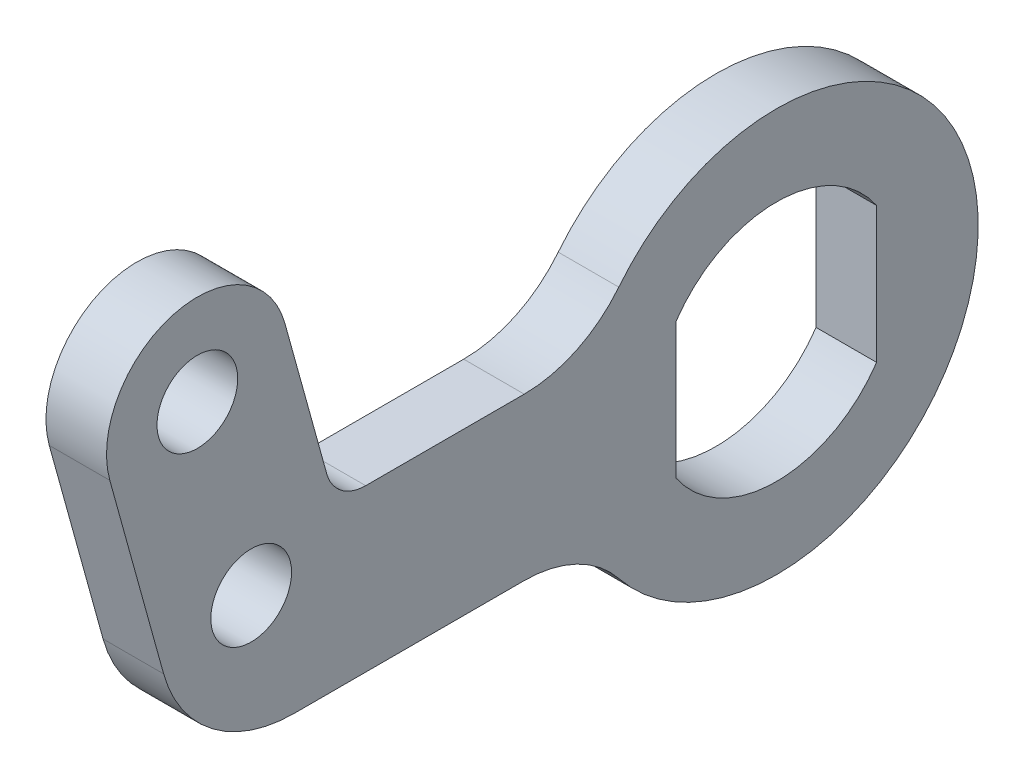
ISO-10303-21;
HEADER;
FILE_DESCRIPTION(('STEP AP214'),'2;1');
FILE_NAME('part.step','',(''),(''),'','','');
FILE_SCHEMA(('AUTOMOTIVE_DESIGN { 1 0 10303 214 1 1 1 1 }'));
ENDSEC;
DATA;
#1=APPLICATION_CONTEXT('core data for automotive mechanical design processes');
#2=APPLICATION_PROTOCOL_DEFINITION('international standard','automotive_design',2000,#1);
#3=PRODUCT_CONTEXT('',#1,'mechanical');
#4=PRODUCT('Part','Part','',(#3));
#5=PRODUCT_RELATED_PRODUCT_CATEGORY('part','',(#4));
#6=PRODUCT_DEFINITION_FORMATION('','',#4);
#7=PRODUCT_DEFINITION_CONTEXT('part definition',#1,'design');
#8=PRODUCT_DEFINITION('design','',#6,#7);
#9=PRODUCT_DEFINITION_SHAPE('','',#8);
#10=(LENGTH_UNIT() NAMED_UNIT(*) SI_UNIT(.MILLI.,.METRE.));
#11=(NAMED_UNIT(*) PLANE_ANGLE_UNIT() SI_UNIT($,.RADIAN.));
#12=(NAMED_UNIT(*) SI_UNIT($,.STERADIAN.) SOLID_ANGLE_UNIT());
#13=UNCERTAINTY_MEASURE_WITH_UNIT(LENGTH_MEASURE(1.E-05),#10,'distance_accuracy_value','');
#14=(GEOMETRIC_REPRESENTATION_CONTEXT(3) GLOBAL_UNCERTAINTY_ASSIGNED_CONTEXT((#13)) GLOBAL_UNIT_ASSIGNED_CONTEXT((#10,
#11,#12)) REPRESENTATION_CONTEXT('',''));
#15=CARTESIAN_POINT('',(0.,0.,0.));
#16=DIRECTION('',(0.,0.,1.));
#17=DIRECTION('',(1.,0.,0.));
#18=AXIS2_PLACEMENT_3D('',#15,#16,#17);
#19=CARTESIAN_POINT('',(1.5,4.99999949839973,-6.7641026));
#20=DIRECTION('',(-1.,0.,0.));
#21=DIRECTION('',(0.,0.,1.));
#22=AXIS2_PLACEMENT_3D('',#19,#20,#21);
#23=PLANE('',#22);
#24=CARTESIAN_POINT('',(1.5,4.99999949839973,-6.7641026));
#25=DIRECTION('',(-1.,0.,0.));
#26=DIRECTION('',(0.,0.,1.));
#27=AXIS2_PLACEMENT_3D('',#24,#25,#26);
#28=CIRCLE('',#27,3.);
#29=CARTESIAN_POINT('',(1.5,3.12499968649983,-9.105977));
#30=VERTEX_POINT('',#29);
#31=CARTESIAN_POINT('',(1.5,1.99999949839973,-6.7641026));
#32=VERTEX_POINT('',#31);
#33=EDGE_CURVE('E174',#30,#32,#28,.T.);
#34=ORIENTED_EDGE('',*,*,#33,.T.);
#35=DIRECTION('',(0.,0.,1.));
#36=VECTOR('',#35,1.);
#37=CARTESIAN_POINT('',(1.5,1.99999949839973,-6.7641026));
#38=LINE('',#37,#36);
#39=CARTESIAN_POINT('',(1.5,1.99999949839973,-2.83655563));
#40=VERTEX_POINT('',#39);
#41=EDGE_CURVE('E177',#32,#40,#38,.T.);
#42=ORIENTED_EDGE('',*,*,#41,.T.);
#43=CARTESIAN_POINT('',(1.5,2.99999949839973,-2.83655563));
#44=DIRECTION('',(-1.,0.,0.));
#45=DIRECTION('',(0.,0.,1.));
#46=AXIS2_PLACEMENT_3D('',#43,#44,#45);
#47=CIRCLE('',#46,1.);
#48=CARTESIAN_POINT('',(1.5,2.7333219044414,-1.87276983383957));
#49=VERTEX_POINT('',#48);
#50=EDGE_CURVE('E180',#40,#49,#47,.T.);
#51=ORIENTED_EDGE('',*,*,#50,.T.);
#52=DIRECTION('',(0.,0.963785796160433,0.266677593958325));
#53=VECTOR('',#52,1.);
#54=CARTESIAN_POINT('',(1.5,2.7333219044414,-1.87276983383957));
#55=LINE('',#54,#53);
#56=CARTESIAN_POINT('',(1.5,6.48340441860382,-0.835129534505308));
#57=VERTEX_POINT('',#56);
#58=EDGE_CURVE('E182',#49,#57,#55,.T.);
#59=ORIENTED_EDGE('',*,*,#58,.T.);
#60=CARTESIAN_POINT('',(1.5,5.88337983219759,1.33338850685566));
#61=DIRECTION('',(1.,0.,0.));
#62=DIRECTION('',(0.,0.,1.));
#63=AXIS2_PLACEMENT_3D('',#60,#61,#62);
#64=CIRCLE('',#63,2.25);
#65=CARTESIAN_POINT('',(1.5,5.28335512053363,3.50190651355807));
#66=VERTEX_POINT('',#65);
#67=EDGE_CURVE('E184',#57,#66,#64,.T.);
#68=ORIENTED_EDGE('',*,*,#67,.T.);
#69=DIRECTION('',(0.,-0.963785780756626,-0.266677649628424));
#70=VECTOR('',#69,1.);
#71=CARTESIAN_POINT('',(1.5,0.464427051240978,2.16851849631784));
#72=LINE('',#71,#70);
#73=CARTESIAN_POINT('',(1.5,0.464427051240978,2.16851849631784));
#74=VERTEX_POINT('',#73);
#75=EDGE_CURVE('E186',#66,#74,#72,.T.);
#76=ORIENTED_EDGE('',*,*,#75,.T.);
#77=CARTESIAN_POINT('',(1.5,1.36063249160027,-1.07041083));
#78=DIRECTION('',(1.,0.,0.));
#79=DIRECTION('',(0.,0.,1.));
#80=AXIS2_PLACEMENT_3D('',#77,#78,#79);
#81=CIRCLE('',#80,3.36063199);
#82=CARTESIAN_POINT('',(1.5,-1.99999949839973,-1.07041083));
#83=VERTEX_POINT('',#82);
#84=EDGE_CURVE('E188',#74,#83,#81,.T.);
#85=ORIENTED_EDGE('',*,*,#84,.T.);
#86=DIRECTION('',(0.,0.,-1.));
#87=VECTOR('',#86,1.);
#88=CARTESIAN_POINT('',(1.5,-1.99999949839973,-6.7641026));
#89=LINE('',#88,#87);
#90=CARTESIAN_POINT('',(1.5,-1.99999949839973,-6.7641026));
#91=VERTEX_POINT('',#90);
#92=EDGE_CURVE('E190',#83,#91,#89,.T.);
#93=ORIENTED_EDGE('',*,*,#92,.T.);
#94=CARTESIAN_POINT('',(1.5,-4.99999949839973,-6.7641026));
#95=DIRECTION('',(-1.,0.,0.));
#96=DIRECTION('',(0.,0.,-1.));
#97=AXIS2_PLACEMENT_3D('',#94,#95,#96);
#98=CIRCLE('',#97,3.);
#99=CARTESIAN_POINT('',(1.5,-3.12499968649983,-9.105977));
#100=VERTEX_POINT('',#99);
#101=EDGE_CURVE('E192',#91,#100,#98,.T.);
#102=ORIENTED_EDGE('',*,*,#101,.T.);
#103=CARTESIAN_POINT('',(1.5,0.,-13.009101));
#104=DIRECTION('',(1.,0.,0.));
#105=DIRECTION('',(0.,0.,1.));
#106=AXIS2_PLACEMENT_3D('',#103,#104,#105);
#107=CIRCLE('',#106,5.);
#108=EDGE_CURVE('E194',#100,#30,#107,.T.);
#109=ORIENTED_EDGE('',*,*,#108,.T.);
#110=EDGE_LOOP('',(#34,#42,#51,#59,#68,#76,#85,#93,#102,#109));
#111=FACE_BOUND('',#110,.T.);
#112=CARTESIAN_POINT('',(1.5,0.,-13.009101));
#113=DIRECTION('',(1.,0.,0.));
#114=DIRECTION('',(0.,0.,1.));
#115=AXIS2_PLACEMENT_3D('',#112,#113,#114);
#116=CIRCLE('',#115,3.00000000000001);
#117=CARTESIAN_POINT('',(1.5,1.68316880053992,-15.492434));
#118=VERTEX_POINT('',#117);
#119=CARTESIAN_POINT('',(1.5,1.68316880053992,-10.525768));
#120=VERTEX_POINT('',#119);
#121=EDGE_CURVE('E135',#118,#120,#116,.T.);
#122=ORIENTED_EDGE('',*,*,#121,.F.);
#123=DIRECTION('',(0.,1.,0.));
#124=VECTOR('',#123,1.);
#125=CARTESIAN_POINT('',(1.5,1.68316880053992,-15.492434));
#126=LINE('',#125,#124);
#127=CARTESIAN_POINT('',(1.5,-1.68316880053992,-15.492434));
#128=VERTEX_POINT('',#127);
#129=EDGE_CURVE('E158',#128,#118,#126,.T.);
#130=ORIENTED_EDGE('',*,*,#129,.F.);
#131=CARTESIAN_POINT('',(1.5,0.,-13.009101));
#132=DIRECTION('',(1.,0.,0.));
#133=DIRECTION('',(0.,0.,-1.));
#134=AXIS2_PLACEMENT_3D('',#131,#132,#133);
#135=CIRCLE('',#134,3.00000000000005);
#136=CARTESIAN_POINT('',(1.5,-1.68316880053992,-10.525768));
#137=VERTEX_POINT('',#136);
#138=EDGE_CURVE('E156',#137,#128,#135,.T.);
#139=ORIENTED_EDGE('',*,*,#138,.F.);
#140=DIRECTION('',(0.,-1.,0.));
#141=VECTOR('',#140,1.);
#142=CARTESIAN_POINT('',(1.5,1.68316880053992,-10.525768));
#143=LINE('',#142,#141);
#144=EDGE_CURVE('E143',#120,#137,#143,.T.);
#145=ORIENTED_EDGE('',*,*,#144,.F.);
#146=EDGE_LOOP('',(#122,#130,#139,#145));
#147=FACE_BOUND('',#146,.T.);
#148=CARTESIAN_POINT('',(1.5,1.064451,0.));
#149=DIRECTION('',(1.,0.,0.));
#150=DIRECTION('',(0.,0.,-1.));
#151=AXIS2_PLACEMENT_3D('',#148,#149,#150);
#152=CIRCLE('',#151,1.);
#153=CARTESIAN_POINT('',(1.5,1.064451,-1.));
#154=VERTEX_POINT('',#153);
#155=EDGE_CURVE('E164',#154,#154,#152,.T.);
#156=ORIENTED_EDGE('',*,*,#155,.F.);
#157=EDGE_LOOP('',(#156));
#158=FACE_BOUND('',#157,.T.);
#159=CARTESIAN_POINT('',(1.5,5.88337983219759,1.33338850685566));
#160=DIRECTION('',(1.,0.,0.));
#161=DIRECTION('',(0.,0.,-1.));
#162=AXIS2_PLACEMENT_3D('',#159,#160,#161);
#163=CIRCLE('',#162,0.999999999999999);
#164=CARTESIAN_POINT('',(1.5,5.88337983219759,0.333388506855665));
#165=VERTEX_POINT('',#164);
#166=EDGE_CURVE('E443',#165,#165,#163,.T.);
#167=ORIENTED_EDGE('',*,*,#166,.F.);
#168=EDGE_LOOP('',(#167));
#169=FACE_BOUND('',#168,.T.);
#170=ADVANCED_FACE('F34',(#111,#147,#158,#169),#23,.F.);
#171=CARTESIAN_POINT('',(0.,4.99999949839973,-6.7641026));
#172=DIRECTION('',(-1.,0.,0.));
#173=DIRECTION('',(0.,0.,1.));
#174=AXIS2_PLACEMENT_3D('',#171,#172,#173);
#175=PLANE('',#174);
#176=CARTESIAN_POINT('',(0.,1.064451,0.));
#177=DIRECTION('',(1.,0.,0.));
#178=DIRECTION('',(0.,0.,-1.));
#179=AXIS2_PLACEMENT_3D('',#176,#177,#178);
#180=CIRCLE('',#179,1.);
#181=CARTESIAN_POINT('',(0.,1.064451,-1.));
#182=VERTEX_POINT('',#181);
#183=EDGE_CURVE('E449',#182,#182,#180,.T.);
#184=ORIENTED_EDGE('',*,*,#183,.T.);
#185=EDGE_LOOP('',(#184));
#186=FACE_BOUND('',#185,.T.);
#187=CARTESIAN_POINT('',(0.,4.99999949839973,-6.7641026));
#188=DIRECTION('',(-1.,0.,0.));
#189=DIRECTION('',(0.,0.,1.));
#190=AXIS2_PLACEMENT_3D('',#187,#188,#189);
#191=CIRCLE('',#190,3.);
#192=CARTESIAN_POINT('',(0.,3.12499968649983,-9.105977));
#193=VERTEX_POINT('',#192);
#194=CARTESIAN_POINT('',(0.,1.99999949839973,-6.7641026));
#195=VERTEX_POINT('',#194);
#196=EDGE_CURVE('E151',#193,#195,#191,.T.);
#197=ORIENTED_EDGE('',*,*,#196,.F.);
#198=CARTESIAN_POINT('',(0.,0.,-13.009101));
#199=DIRECTION('',(1.,0.,0.));
#200=DIRECTION('',(0.,0.,1.));
#201=AXIS2_PLACEMENT_3D('',#198,#199,#200);
#202=CIRCLE('',#201,5.);
#203=CARTESIAN_POINT('',(0.,-3.12499968649983,-9.105977));
#204=VERTEX_POINT('',#203);
#205=EDGE_CURVE('E178',#204,#193,#202,.T.);
#206=ORIENTED_EDGE('',*,*,#205,.F.);
#207=CARTESIAN_POINT('',(0.,-4.99999949839973,-6.7641026));
#208=DIRECTION('',(-1.,0.,0.));
#209=DIRECTION('',(0.,0.,-1.));
#210=AXIS2_PLACEMENT_3D('',#207,#208,#209);
#211=CIRCLE('',#210,3.);
#212=CARTESIAN_POINT('',(0.,-1.99999949839973,-6.7641026));
#213=VERTEX_POINT('',#212);
#214=EDGE_CURVE('E213',#213,#204,#211,.T.);
#215=ORIENTED_EDGE('',*,*,#214,.F.);
#216=DIRECTION('',(0.,0.,-1.));
#217=VECTOR('',#216,1.);
#218=CARTESIAN_POINT('',(0.,-1.99999949839973,-6.7641026));
#219=LINE('',#218,#217);
#220=CARTESIAN_POINT('',(0.,-1.99999949839973,-1.07041083));
#221=VERTEX_POINT('',#220);
#222=EDGE_CURVE('E211',#221,#213,#219,.T.);
#223=ORIENTED_EDGE('',*,*,#222,.F.);
#224=CARTESIAN_POINT('',(0.,1.36063249160027,-1.07041083));
#225=DIRECTION('',(1.,0.,0.));
#226=DIRECTION('',(0.,0.,1.));
#227=AXIS2_PLACEMENT_3D('',#224,#225,#226);
#228=CIRCLE('',#227,3.36063199);
#229=CARTESIAN_POINT('',(0.,0.464427051240978,2.16851849631784));
#230=VERTEX_POINT('',#229);
#231=EDGE_CURVE('E209',#230,#221,#228,.T.);
#232=ORIENTED_EDGE('',*,*,#231,.F.);
#233=DIRECTION('',(0.,-0.963785780756626,-0.266677649628424));
#234=VECTOR('',#233,1.);
#235=CARTESIAN_POINT('',(0.,0.464427051240978,2.16851849631784));
#236=LINE('',#235,#234);
#237=CARTESIAN_POINT('',(0.,5.28335512053363,3.50190651355807));
#238=VERTEX_POINT('',#237);
#239=EDGE_CURVE('E207',#238,#230,#236,.T.);
#240=ORIENTED_EDGE('',*,*,#239,.F.);
#241=CARTESIAN_POINT('',(0.,5.88337983219759,1.33338850685566));
#242=DIRECTION('',(1.,0.,0.));
#243=DIRECTION('',(0.,0.,1.));
#244=AXIS2_PLACEMENT_3D('',#241,#242,#243);
#245=CIRCLE('',#244,2.25);
#246=CARTESIAN_POINT('',(0.,6.48340441860382,-0.835129534505308));
#247=VERTEX_POINT('',#246);
#248=EDGE_CURVE('E205',#247,#238,#245,.T.);
#249=ORIENTED_EDGE('',*,*,#248,.F.);
#250=DIRECTION('',(0.,0.963785796160433,0.266677593958325));
#251=VECTOR('',#250,1.);
#252=CARTESIAN_POINT('',(0.,2.7333219044414,-1.87276983383957));
#253=LINE('',#252,#251);
#254=CARTESIAN_POINT('',(0.,2.7333219044414,-1.87276983383957));
#255=VERTEX_POINT('',#254);
#256=EDGE_CURVE('E203',#255,#247,#253,.T.);
#257=ORIENTED_EDGE('',*,*,#256,.F.);
#258=CARTESIAN_POINT('',(0.,2.99999949839973,-2.83655563));
#259=DIRECTION('',(-1.,0.,0.));
#260=DIRECTION('',(0.,0.,1.));
#261=AXIS2_PLACEMENT_3D('',#258,#259,#260);
#262=CIRCLE('',#261,1.);
#263=CARTESIAN_POINT('',(0.,1.99999949839973,-2.83655563));
#264=VERTEX_POINT('',#263);
#265=EDGE_CURVE('E201',#264,#255,#262,.T.);
#266=ORIENTED_EDGE('',*,*,#265,.F.);
#267=DIRECTION('',(0.,0.,1.));
#268=VECTOR('',#267,1.);
#269=CARTESIAN_POINT('',(0.,1.99999949839973,-6.7641026));
#270=LINE('',#269,#268);
#271=EDGE_CURVE('E199',#195,#264,#270,.T.);
#272=ORIENTED_EDGE('',*,*,#271,.F.);
#273=EDGE_LOOP('',(#197,#206,#215,#223,#232,#240,#249,#257,#266,#272));
#274=FACE_BOUND('',#273,.T.);
#275=DIRECTION('',(0.,1.,0.));
#276=VECTOR('',#275,1.);
#277=CARTESIAN_POINT('',(0.,1.68316880053992,-15.492434));
#278=LINE('',#277,#276);
#279=CARTESIAN_POINT('',(0.,-1.68316880053992,-15.492434));
#280=VERTEX_POINT('',#279);
#281=CARTESIAN_POINT('',(0.,1.68316880053992,-15.492434));
#282=VERTEX_POINT('',#281);
#283=EDGE_CURVE('E144',#280,#282,#278,.T.);
#284=ORIENTED_EDGE('',*,*,#283,.T.);
#285=CARTESIAN_POINT('',(0.,0.,-13.009101));
#286=DIRECTION('',(1.,0.,0.));
#287=DIRECTION('',(0.,0.,1.));
#288=AXIS2_PLACEMENT_3D('',#285,#286,#287);
#289=CIRCLE('',#288,3.00000000000001);
#290=CARTESIAN_POINT('',(0.,1.68316880053992,-10.525768));
#291=VERTEX_POINT('',#290);
#292=EDGE_CURVE('E57',#282,#291,#289,.T.);
#293=ORIENTED_EDGE('',*,*,#292,.T.);
#294=DIRECTION('',(0.,-1.,0.));
#295=VECTOR('',#294,1.);
#296=CARTESIAN_POINT('',(0.,1.68316880053992,-10.525768));
#297=LINE('',#296,#295);
#298=CARTESIAN_POINT('',(0.,-1.68316880053992,-10.525768));
#299=VERTEX_POINT('',#298);
#300=EDGE_CURVE('E150',#291,#299,#297,.T.);
#301=ORIENTED_EDGE('',*,*,#300,.T.);
#302=CARTESIAN_POINT('',(0.,0.,-13.009101));
#303=DIRECTION('',(1.,0.,0.));
#304=DIRECTION('',(0.,0.,-1.));
#305=AXIS2_PLACEMENT_3D('',#302,#303,#304);
#306=CIRCLE('',#305,3.00000000000005);
#307=EDGE_CURVE('E166',#299,#280,#306,.T.);
#308=ORIENTED_EDGE('',*,*,#307,.T.);
#309=EDGE_LOOP('',(#284,#293,#301,#308));
#310=FACE_BOUND('',#309,.T.);
#311=CARTESIAN_POINT('',(0.,5.88337983219759,1.33338850685566));
#312=DIRECTION('',(1.,0.,0.));
#313=DIRECTION('',(0.,0.,-1.));
#314=AXIS2_PLACEMENT_3D('',#311,#312,#313);
#315=CIRCLE('',#314,0.999999999999999);
#316=CARTESIAN_POINT('',(0.,5.88337983219759,0.333388506855665));
#317=VERTEX_POINT('',#316);
#318=EDGE_CURVE('E446',#317,#317,#315,.T.);
#319=ORIENTED_EDGE('',*,*,#318,.T.);
#320=EDGE_LOOP('',(#319));
#321=FACE_BOUND('',#320,.T.);
#322=ADVANCED_FACE('F249',(#186,#274,#310,#321),#175,.T.);
#323=CARTESIAN_POINT('',(1.5,4.99999949839973,-6.7641026));
#324=DIRECTION('',(-1.,0.,0.));
#325=DIRECTION('',(0.,0.,1.));
#326=AXIS2_PLACEMENT_3D('',#323,#324,#325);
#327=CYLINDRICAL_SURFACE('',#326,3.);
#328=ORIENTED_EDGE('',*,*,#196,.T.);
#329=DIRECTION('',(-1.,0.,0.));
#330=VECTOR('',#329,1.);
#331=CARTESIAN_POINT('',(1.5,1.99999949839973,-6.7641026));
#332=LINE('',#331,#330);
#333=EDGE_CURVE('E11',#32,#195,#332,.T.);
#334=ORIENTED_EDGE('',*,*,#333,.F.);
#335=ORIENTED_EDGE('',*,*,#33,.F.);
#336=DIRECTION('',(-1.,0.,0.));
#337=VECTOR('',#336,1.);
#338=CARTESIAN_POINT('',(1.5,3.12499968649983,-9.105977));
#339=LINE('',#338,#337);
#340=EDGE_CURVE('E196',#30,#193,#339,.T.);
#341=ORIENTED_EDGE('',*,*,#340,.T.);
#342=EDGE_LOOP('',(#328,#334,#335,#341));
#343=FACE_BOUND('',#342,.T.);
#344=ADVANCED_FACE('F36',(#343),#327,.F.);
#345=CARTESIAN_POINT('',(1.5,1.99999949839973,-6.7641026));
#346=DIRECTION('',(0.,-1.,0.));
#347=DIRECTION('',(0.,0.,-1.));
#348=AXIS2_PLACEMENT_3D('',#345,#346,#347);
#349=PLANE('',#348);
#350=ORIENTED_EDGE('',*,*,#271,.T.);
#351=DIRECTION('',(-1.,0.,0.));
#352=VECTOR('',#351,1.);
#353=CARTESIAN_POINT('',(1.5,1.99999949839973,-2.83655563));
#354=LINE('',#353,#352);
#355=EDGE_CURVE('E42',#40,#264,#354,.T.);
#356=ORIENTED_EDGE('',*,*,#355,.F.);
#357=ORIENTED_EDGE('',*,*,#41,.F.);
#358=ORIENTED_EDGE('',*,*,#333,.T.);
#359=EDGE_LOOP('',(#350,#356,#357,#358));
#360=FACE_BOUND('',#359,.T.);
#361=ADVANCED_FACE('F266',(#360),#349,.F.);
#362=CARTESIAN_POINT('',(1.5,2.99999949839973,-2.83655563));
#363=DIRECTION('',(-1.,0.,0.));
#364=DIRECTION('',(0.,0.,1.));
#365=AXIS2_PLACEMENT_3D('',#362,#363,#364);
#366=CYLINDRICAL_SURFACE('',#365,1.);
#367=ORIENTED_EDGE('',*,*,#265,.T.);
#368=DIRECTION('',(-1.,0.,0.));
#369=VECTOR('',#368,1.);
#370=CARTESIAN_POINT('',(1.5,2.7333219044414,-1.87276983383957));
#371=LINE('',#370,#369);
#372=EDGE_CURVE('E236',#49,#255,#371,.T.);
#373=ORIENTED_EDGE('',*,*,#372,.F.);
#374=ORIENTED_EDGE('',*,*,#50,.F.);
#375=ORIENTED_EDGE('',*,*,#355,.T.);
#376=EDGE_LOOP('',(#367,#373,#374,#375));
#377=FACE_BOUND('',#376,.T.);
#378=ADVANCED_FACE('F243',(#377),#366,.F.);
#379=CARTESIAN_POINT('',(1.5,2.7333219044414,-1.87276983383957));
#380=DIRECTION('',(0.,-0.266677593958325,0.963785796160432));
#381=DIRECTION('',(0.,-0.963785796160433,-0.266677593958325));
#382=AXIS2_PLACEMENT_3D('',#379,#380,#381);
#383=PLANE('',#382);
#384=ORIENTED_EDGE('',*,*,#256,.T.);
#385=DIRECTION('',(-1.,0.,0.));
#386=VECTOR('',#385,1.);
#387=CARTESIAN_POINT('',(1.5,6.48340441860382,-0.835129534505308));
#388=LINE('',#387,#386);
#389=EDGE_CURVE('E233',#57,#247,#388,.T.);
#390=ORIENTED_EDGE('',*,*,#389,.F.);
#391=ORIENTED_EDGE('',*,*,#58,.F.);
#392=ORIENTED_EDGE('',*,*,#372,.T.);
#393=EDGE_LOOP('',(#384,#390,#391,#392));
#394=FACE_BOUND('',#393,.T.);
#395=ADVANCED_FACE('F255',(#394),#383,.F.);
#396=CARTESIAN_POINT('',(1.5,5.88337983219759,1.33338850685566));
#397=DIRECTION('',(-1.,0.,0.));
#398=DIRECTION('',(0.,0.,1.));
#399=AXIS2_PLACEMENT_3D('',#396,#397,#398);
#400=CYLINDRICAL_SURFACE('',#399,2.25);
#401=ORIENTED_EDGE('',*,*,#248,.T.);
#402=DIRECTION('',(-1.,0.,0.));
#403=VECTOR('',#402,1.);
#404=CARTESIAN_POINT('',(1.5,5.28335512053363,3.50190651355807));
#405=LINE('',#404,#403);
#406=EDGE_CURVE('E230',#66,#238,#405,.T.);
#407=ORIENTED_EDGE('',*,*,#406,.F.);
#408=ORIENTED_EDGE('',*,*,#67,.F.);
#409=ORIENTED_EDGE('',*,*,#389,.T.);
#410=EDGE_LOOP('',(#401,#407,#408,#409));
#411=FACE_BOUND('',#410,.T.);
#412=ADVANCED_FACE('F259',(#411),#400,.T.);
#413=CARTESIAN_POINT('',(1.5,0.464427051240978,2.16851849631784));
#414=DIRECTION('',(0.,0.266677649628424,-0.963785780756626));
#415=DIRECTION('',(0.,0.963785780756626,0.266677649628424));
#416=AXIS2_PLACEMENT_3D('',#413,#414,#415);
#417=PLANE('',#416);
#418=ORIENTED_EDGE('',*,*,#239,.T.);
#419=DIRECTION('',(-1.,0.,0.));
#420=VECTOR('',#419,1.);
#421=CARTESIAN_POINT('',(1.5,0.464427051240978,2.16851849631784));
#422=LINE('',#421,#420);
#423=EDGE_CURVE('E227',#74,#230,#422,.T.);
#424=ORIENTED_EDGE('',*,*,#423,.F.);
#425=ORIENTED_EDGE('',*,*,#75,.F.);
#426=ORIENTED_EDGE('',*,*,#406,.T.);
#427=EDGE_LOOP('',(#418,#424,#425,#426));
#428=FACE_BOUND('',#427,.T.);
#429=ADVANCED_FACE('F289',(#428),#417,.F.);
#430=CARTESIAN_POINT('',(1.5,1.36063249160027,-1.07041083));
#431=DIRECTION('',(-1.,0.,0.));
#432=DIRECTION('',(0.,0.,1.));
#433=AXIS2_PLACEMENT_3D('',#430,#431,#432);
#434=CYLINDRICAL_SURFACE('',#433,3.36063199);
#435=ORIENTED_EDGE('',*,*,#231,.T.);
#436=DIRECTION('',(-1.,0.,0.));
#437=VECTOR('',#436,1.);
#438=CARTESIAN_POINT('',(1.5,-1.99999949839973,-1.07041083));
#439=LINE('',#438,#437);
#440=EDGE_CURVE('E224',#83,#221,#439,.T.);
#441=ORIENTED_EDGE('',*,*,#440,.F.);
#442=ORIENTED_EDGE('',*,*,#84,.F.);
#443=ORIENTED_EDGE('',*,*,#423,.T.);
#444=EDGE_LOOP('',(#435,#441,#442,#443));
#445=FACE_BOUND('',#444,.T.);
#446=ADVANCED_FACE('F286',(#445),#434,.T.);
#447=CARTESIAN_POINT('',(1.5,-1.99999949839973,-6.7641026));
#448=DIRECTION('',(0.,1.,0.));
#449=DIRECTION('',(0.,0.,1.));
#450=AXIS2_PLACEMENT_3D('',#447,#448,#449);
#451=PLANE('',#450);
#452=ORIENTED_EDGE('',*,*,#222,.T.);
#453=DIRECTION('',(-1.,0.,0.));
#454=VECTOR('',#453,1.);
#455=CARTESIAN_POINT('',(1.5,-1.99999949839973,-6.7641026));
#456=LINE('',#455,#454);
#457=EDGE_CURVE('E221',#91,#213,#456,.T.);
#458=ORIENTED_EDGE('',*,*,#457,.F.);
#459=ORIENTED_EDGE('',*,*,#92,.F.);
#460=ORIENTED_EDGE('',*,*,#440,.T.);
#461=EDGE_LOOP('',(#452,#458,#459,#460));
#462=FACE_BOUND('',#461,.T.);
#463=ADVANCED_FACE('F282',(#462),#451,.F.);
#464=CARTESIAN_POINT('',(1.5,-4.99999949839973,-6.7641026));
#465=DIRECTION('',(-1.,0.,0.));
#466=DIRECTION('',(0.,0.,1.));
#467=AXIS2_PLACEMENT_3D('',#464,#465,#466);
#468=CYLINDRICAL_SURFACE('',#467,3.);
#469=ORIENTED_EDGE('',*,*,#214,.T.);
#470=DIRECTION('',(-1.,0.,0.));
#471=VECTOR('',#470,1.);
#472=CARTESIAN_POINT('',(1.5,-3.12499968649983,-9.105977));
#473=LINE('',#472,#471);
#474=EDGE_CURVE('E218',#100,#204,#473,.T.);
#475=ORIENTED_EDGE('',*,*,#474,.F.);
#476=ORIENTED_EDGE('',*,*,#101,.F.);
#477=ORIENTED_EDGE('',*,*,#457,.T.);
#478=EDGE_LOOP('',(#469,#475,#476,#477));
#479=FACE_BOUND('',#478,.T.);
#480=ADVANCED_FACE('F278',(#479),#468,.F.);
#481=CARTESIAN_POINT('',(1.5,0.,-13.009101));
#482=DIRECTION('',(-1.,0.,0.));
#483=DIRECTION('',(0.,0.,1.));
#484=AXIS2_PLACEMENT_3D('',#481,#482,#483);
#485=CYLINDRICAL_SURFACE('',#484,5.);
#486=ORIENTED_EDGE('',*,*,#205,.T.);
#487=ORIENTED_EDGE('',*,*,#340,.F.);
#488=ORIENTED_EDGE('',*,*,#108,.F.);
#489=ORIENTED_EDGE('',*,*,#474,.T.);
#490=EDGE_LOOP('',(#486,#487,#488,#489));
#491=FACE_BOUND('',#490,.T.);
#492=ADVANCED_FACE('F273',(#491),#485,.T.);
#493=CARTESIAN_POINT('',(1.5,0.,-13.009101));
#494=DIRECTION('',(-1.,0.,0.));
#495=DIRECTION('',(0.,0.,1.));
#496=AXIS2_PLACEMENT_3D('',#493,#494,#495);
#497=CYLINDRICAL_SURFACE('',#496,3.00000000000001);
#498=ORIENTED_EDGE('',*,*,#292,.F.);
#499=DIRECTION('',(-1.,0.,0.));
#500=VECTOR('',#499,1.);
#501=CARTESIAN_POINT('',(1.5,1.68316880053992,-15.492434));
#502=LINE('',#501,#500);
#503=EDGE_CURVE('E139',#118,#282,#502,.T.);
#504=ORIENTED_EDGE('',*,*,#503,.F.);
#505=ORIENTED_EDGE('',*,*,#121,.T.);
#506=DIRECTION('',(-1.,0.,0.));
#507=VECTOR('',#506,1.);
#508=CARTESIAN_POINT('',(1.5,1.68316880053992,-10.525768));
#509=LINE('',#508,#507);
#510=EDGE_CURVE('E138',#120,#291,#509,.T.);
#511=ORIENTED_EDGE('',*,*,#510,.T.);
#512=EDGE_LOOP('',(#498,#504,#505,#511));
#513=FACE_BOUND('',#512,.T.);
#514=ADVANCED_FACE('F137',(#513),#497,.F.);
#515=CARTESIAN_POINT('',(1.5,1.68316880053992,-10.525768));
#516=DIRECTION('',(0.,0.,-1.));
#517=DIRECTION('',(-1.,0.,0.));
#518=AXIS2_PLACEMENT_3D('',#515,#516,#517);
#519=PLANE('',#518);
#520=ORIENTED_EDGE('',*,*,#300,.F.);
#521=ORIENTED_EDGE('',*,*,#510,.F.);
#522=ORIENTED_EDGE('',*,*,#144,.T.);
#523=DIRECTION('',(-1.,0.,0.));
#524=VECTOR('',#523,1.);
#525=CARTESIAN_POINT('',(1.5,-1.68316880053992,-10.525768));
#526=LINE('',#525,#524);
#527=EDGE_CURVE('E152',#137,#299,#526,.T.);
#528=ORIENTED_EDGE('',*,*,#527,.T.);
#529=EDGE_LOOP('',(#520,#521,#522,#528));
#530=FACE_BOUND('',#529,.T.);
#531=ADVANCED_FACE('F147',(#530),#519,.T.);
#532=CARTESIAN_POINT('',(1.5,0.,-13.009101));
#533=DIRECTION('',(-1.,0.,0.));
#534=DIRECTION('',(0.,0.,1.));
#535=AXIS2_PLACEMENT_3D('',#532,#533,#534);
#536=CYLINDRICAL_SURFACE('',#535,3.00000000000005);
#537=ORIENTED_EDGE('',*,*,#307,.F.);
#538=ORIENTED_EDGE('',*,*,#527,.F.);
#539=ORIENTED_EDGE('',*,*,#138,.T.);
#540=DIRECTION('',(-1.,0.,0.));
#541=VECTOR('',#540,1.);
#542=CARTESIAN_POINT('',(1.5,-1.68316880053992,-15.492434));
#543=LINE('',#542,#541);
#544=EDGE_CURVE('E49',#128,#280,#543,.T.);
#545=ORIENTED_EDGE('',*,*,#544,.T.);
#546=EDGE_LOOP('',(#537,#538,#539,#545));
#547=FACE_BOUND('',#546,.T.);
#548=ADVANCED_FACE('F336',(#547),#536,.F.);
#549=CARTESIAN_POINT('',(1.5,1.68316880053992,-15.492434));
#550=DIRECTION('',(0.,0.,1.));
#551=DIRECTION('',(1.,0.,0.));
#552=AXIS2_PLACEMENT_3D('',#549,#550,#551);
#553=PLANE('',#552);
#554=ORIENTED_EDGE('',*,*,#283,.F.);
#555=ORIENTED_EDGE('',*,*,#544,.F.);
#556=ORIENTED_EDGE('',*,*,#129,.T.);
#557=ORIENTED_EDGE('',*,*,#503,.T.);
#558=EDGE_LOOP('',(#554,#555,#556,#557));
#559=FACE_BOUND('',#558,.T.);
#560=ADVANCED_FACE('F342',(#559),#553,.T.);
#561=CARTESIAN_POINT('',(1.5,1.064451,0.));
#562=DIRECTION('',(-1.,0.,0.));
#563=DIRECTION('',(0.,0.,1.));
#564=AXIS2_PLACEMENT_3D('',#561,#562,#563);
#565=CYLINDRICAL_SURFACE('',#564,1.);
#566=ORIENTED_EDGE('',*,*,#155,.T.);
#567=EDGE_LOOP('',(#566));
#568=FACE_BOUND('',#567,.T.);
#569=ORIENTED_EDGE('',*,*,#183,.F.);
#570=EDGE_LOOP('',(#569));
#571=FACE_BOUND('',#570,.T.);
#572=ADVANCED_FACE('F350',(#568,#571),#565,.F.);
#573=CARTESIAN_POINT('',(1.5,5.88337983219759,1.33338850685566));
#574=DIRECTION('',(-1.,0.,0.));
#575=DIRECTION('',(0.,0.,1.));
#576=AXIS2_PLACEMENT_3D('',#573,#574,#575);
#577=CYLINDRICAL_SURFACE('',#576,0.999999999999999);
#578=ORIENTED_EDGE('',*,*,#166,.T.);
#579=EDGE_LOOP('',(#578));
#580=FACE_BOUND('',#579,.T.);
#581=ORIENTED_EDGE('',*,*,#318,.F.);
#582=EDGE_LOOP('',(#581));
#583=FACE_BOUND('',#582,.T.);
#584=ADVANCED_FACE('F357',(#580,#583),#577,.F.);
#585=CLOSED_SHELL('',(#170,#322,#344,#361,#378,#395,#412,#429,#446,#463,#480,#492,#514,#531,
#548,#560,#572,#584));
#586=MANIFOLD_SOLID_BREP('B2',#585);
#587=ADVANCED_BREP_SHAPE_REPRESENTATION('',(#18,#586),#14);
#588=SHAPE_DEFINITION_REPRESENTATION(#9,#587);
ENDSEC;
END-ISO-10303-21;
